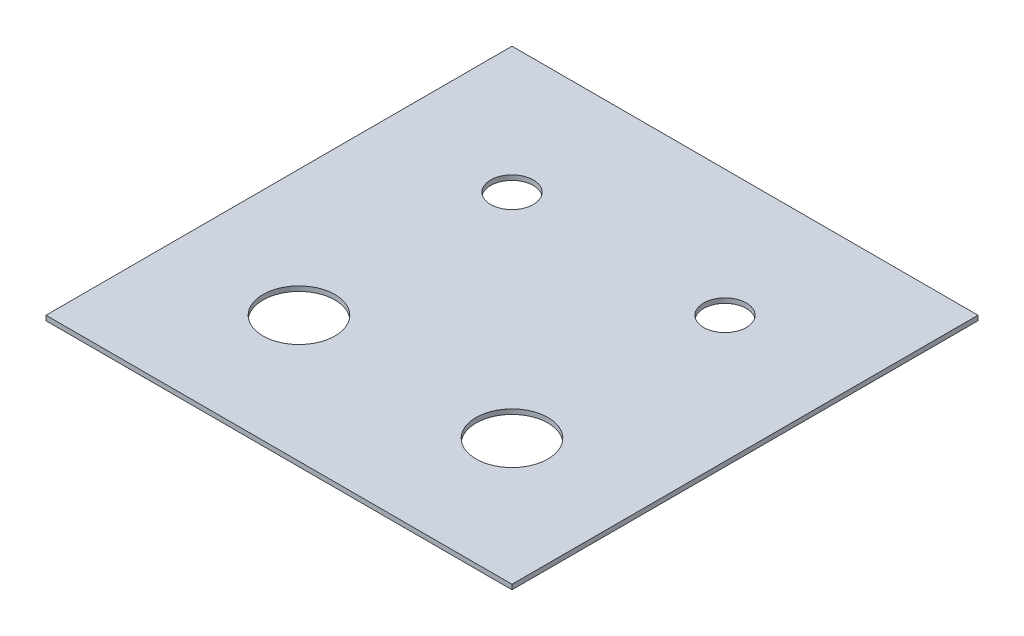
ISO-10303-21;
HEADER;
FILE_DESCRIPTION(('STEP AP214'),'2;1');
FILE_NAME('part.step','',(''),(''),'','','');
FILE_SCHEMA(('AUTOMOTIVE_DESIGN { 1 0 10303 214 1 1 1 1 }'));
ENDSEC;
DATA;
#1=APPLICATION_CONTEXT('core data for automotive mechanical design processes');
#2=APPLICATION_PROTOCOL_DEFINITION('international standard','automotive_design',2000,#1);
#3=PRODUCT_CONTEXT('',#1,'mechanical');
#4=PRODUCT('Part','Part','',(#3));
#5=PRODUCT_RELATED_PRODUCT_CATEGORY('part','',(#4));
#6=PRODUCT_DEFINITION_FORMATION('','',#4);
#7=PRODUCT_DEFINITION_CONTEXT('part definition',#1,'design');
#8=PRODUCT_DEFINITION('design','',#6,#7);
#9=PRODUCT_DEFINITION_SHAPE('','',#8);
#10=(LENGTH_UNIT() NAMED_UNIT(*) SI_UNIT(.MILLI.,.METRE.));
#11=(NAMED_UNIT(*) PLANE_ANGLE_UNIT() SI_UNIT($,.RADIAN.));
#12=(NAMED_UNIT(*) SI_UNIT($,.STERADIAN.) SOLID_ANGLE_UNIT());
#13=UNCERTAINTY_MEASURE_WITH_UNIT(LENGTH_MEASURE(1.E-05),#10,'distance_accuracy_value','');
#14=(GEOMETRIC_REPRESENTATION_CONTEXT(3) GLOBAL_UNCERTAINTY_ASSIGNED_CONTEXT((#13)) GLOBAL_UNIT_ASSIGNED_CONTEXT((#10,
#11,#12)) REPRESENTATION_CONTEXT('',''));
#15=CARTESIAN_POINT('',(0.,0.,0.));
#16=DIRECTION('',(0.,0.,1.));
#17=DIRECTION('',(1.,0.,0.));
#18=AXIS2_PLACEMENT_3D('',#15,#16,#17);
#19=CARTESIAN_POINT('',(0.,0.46,0.));
#20=DIRECTION('',(0.,1.,0.));
#21=DIRECTION('',(0.,0.,1.));
#22=AXIS2_PLACEMENT_3D('',#19,#20,#21);
#23=PLANE('',#22);
#24=CARTESIAN_POINT('',(-10.16,0.46,10.16));
#25=DIRECTION('',(0.,1.,0.));
#26=DIRECTION('',(0.,0.,1.));
#27=AXIS2_PLACEMENT_3D('',#24,#25,#26);
#28=CIRCLE('',#27,3.429);
#29=CARTESIAN_POINT('',(-10.16,0.46,13.589));
#30=VERTEX_POINT('',#29);
#31=EDGE_CURVE('E147',#30,#30,#28,.T.);
#32=ORIENTED_EDGE('',*,*,#31,.F.);
#33=EDGE_LOOP('',(#32));
#34=FACE_BOUND('',#33,.T.);
#35=CARTESIAN_POINT('',(-10.16,0.46,-10.16));
#36=DIRECTION('',(0.,1.,0.));
#37=DIRECTION('',(0.,0.,1.));
#38=AXIS2_PLACEMENT_3D('',#35,#36,#37);
#39=CIRCLE('',#38,2.032);
#40=CARTESIAN_POINT('',(-10.16,0.46,-8.128));
#41=VERTEX_POINT('',#40);
#42=EDGE_CURVE('E117',#41,#41,#39,.T.);
#43=ORIENTED_EDGE('',*,*,#42,.F.);
#44=EDGE_LOOP('',(#43));
#45=FACE_BOUND('',#44,.T.);
#46=DIRECTION('',(0.,0.,-1.));
#47=VECTOR('',#46,1.);
#48=CARTESIAN_POINT('',(22.225,0.46,-22.225));
#49=LINE('',#48,#47);
#50=CARTESIAN_POINT('',(22.225,0.46,22.225));
#51=VERTEX_POINT('',#50);
#52=CARTESIAN_POINT('',(22.225,0.46,-22.225));
#53=VERTEX_POINT('',#52);
#54=EDGE_CURVE('E97',#51,#53,#49,.T.);
#55=ORIENTED_EDGE('',*,*,#54,.T.);
#56=DIRECTION('',(-1.,0.,0.));
#57=VECTOR('',#56,1.);
#58=CARTESIAN_POINT('',(-22.225,0.46,-22.225));
#59=LINE('',#58,#57);
#60=CARTESIAN_POINT('',(-22.225,0.46,-22.225));
#61=VERTEX_POINT('',#60);
#62=EDGE_CURVE('E92',#53,#61,#59,.T.);
#63=ORIENTED_EDGE('',*,*,#62,.T.);
#64=DIRECTION('',(0.,0.,1.));
#65=VECTOR('',#64,1.);
#66=CARTESIAN_POINT('',(-22.225,0.46,-22.225));
#67=LINE('',#66,#65);
#68=CARTESIAN_POINT('',(-22.225,0.46,22.225));
#69=VERTEX_POINT('',#68);
#70=EDGE_CURVE('E95',#61,#69,#67,.T.);
#71=ORIENTED_EDGE('',*,*,#70,.T.);
#72=DIRECTION('',(1.,0.,0.));
#73=VECTOR('',#72,1.);
#74=CARTESIAN_POINT('',(-22.225,0.46,22.225));
#75=LINE('',#74,#73);
#76=EDGE_CURVE('E62',#69,#51,#75,.T.);
#77=ORIENTED_EDGE('',*,*,#76,.T.);
#78=EDGE_LOOP('',(#55,#63,#71,#77));
#79=FACE_BOUND('',#78,.T.);
#80=CARTESIAN_POINT('',(10.16,0.46,-10.16));
#81=DIRECTION('',(0.,1.,0.));
#82=DIRECTION('',(0.,0.,-1.));
#83=AXIS2_PLACEMENT_3D('',#80,#81,#82);
#84=CIRCLE('',#83,2.032);
#85=CARTESIAN_POINT('',(10.16,0.46,-12.192));
#86=VERTEX_POINT('',#85);
#87=EDGE_CURVE('E139',#86,#86,#84,.T.);
#88=ORIENTED_EDGE('',*,*,#87,.F.);
#89=EDGE_LOOP('',(#88));
#90=FACE_BOUND('',#89,.T.);
#91=CARTESIAN_POINT('',(10.16,0.46,10.16));
#92=DIRECTION('',(0.,1.,0.));
#93=DIRECTION('',(0.,0.,-1.));
#94=AXIS2_PLACEMENT_3D('',#91,#92,#93);
#95=CIRCLE('',#94,3.429);
#96=CARTESIAN_POINT('',(10.16,0.46,6.731));
#97=VERTEX_POINT('',#96);
#98=EDGE_CURVE('E155',#97,#97,#95,.T.);
#99=ORIENTED_EDGE('',*,*,#98,.F.);
#100=EDGE_LOOP('',(#99));
#101=FACE_BOUND('',#100,.T.);
#102=ADVANCED_FACE('F44',(#34,#45,#79,#90,#101),#23,.T.);
#103=CARTESIAN_POINT('',(0.,0.,0.));
#104=DIRECTION('',(0.,1.,0.));
#105=DIRECTION('',(0.,0.,1.));
#106=AXIS2_PLACEMENT_3D('',#103,#104,#105);
#107=PLANE('',#106);
#108=DIRECTION('',(0.,0.,-1.));
#109=VECTOR('',#108,1.);
#110=CARTESIAN_POINT('',(22.225,0.,-22.225));
#111=LINE('',#110,#109);
#112=CARTESIAN_POINT('',(22.225,0.,22.225));
#113=VERTEX_POINT('',#112);
#114=CARTESIAN_POINT('',(22.225,0.,-22.225));
#115=VERTEX_POINT('',#114);
#116=EDGE_CURVE('E113',#113,#115,#111,.T.);
#117=ORIENTED_EDGE('',*,*,#116,.F.);
#118=DIRECTION('',(1.,0.,0.));
#119=VECTOR('',#118,1.);
#120=CARTESIAN_POINT('',(-22.225,0.,22.225));
#121=LINE('',#120,#119);
#122=CARTESIAN_POINT('',(-22.225,0.,22.225));
#123=VERTEX_POINT('',#122);
#124=EDGE_CURVE('E85',#123,#113,#121,.T.);
#125=ORIENTED_EDGE('',*,*,#124,.F.);
#126=DIRECTION('',(0.,0.,1.));
#127=VECTOR('',#126,1.);
#128=CARTESIAN_POINT('',(-22.225,0.,-22.225));
#129=LINE('',#128,#127);
#130=CARTESIAN_POINT('',(-22.225,0.,-22.225));
#131=VERTEX_POINT('',#130);
#132=EDGE_CURVE('E79',#131,#123,#129,.T.);
#133=ORIENTED_EDGE('',*,*,#132,.F.);
#134=DIRECTION('',(-1.,0.,0.));
#135=VECTOR('',#134,1.);
#136=CARTESIAN_POINT('',(-22.225,0.,-22.225));
#137=LINE('',#136,#135);
#138=EDGE_CURVE('E102',#115,#131,#137,.T.);
#139=ORIENTED_EDGE('',*,*,#138,.F.);
#140=EDGE_LOOP('',(#117,#125,#133,#139));
#141=FACE_BOUND('',#140,.T.);
#142=CARTESIAN_POINT('',(-10.16,0.,-10.16));
#143=DIRECTION('',(0.,1.,0.));
#144=DIRECTION('',(0.,0.,1.));
#145=AXIS2_PLACEMENT_3D('',#142,#143,#144);
#146=CIRCLE('',#145,2.032);
#147=CARTESIAN_POINT('',(-10.16,0.,-8.128));
#148=VERTEX_POINT('',#147);
#149=EDGE_CURVE('E135',#148,#148,#146,.T.);
#150=ORIENTED_EDGE('',*,*,#149,.T.);
#151=EDGE_LOOP('',(#150));
#152=FACE_BOUND('',#151,.T.);
#153=CARTESIAN_POINT('',(10.16,0.,-10.16));
#154=DIRECTION('',(0.,1.,0.));
#155=DIRECTION('',(0.,0.,-1.));
#156=AXIS2_PLACEMENT_3D('',#153,#154,#155);
#157=CIRCLE('',#156,2.032);
#158=CARTESIAN_POINT('',(10.16,0.,-12.192));
#159=VERTEX_POINT('',#158);
#160=EDGE_CURVE('E143',#159,#159,#157,.T.);
#161=ORIENTED_EDGE('',*,*,#160,.T.);
#162=EDGE_LOOP('',(#161));
#163=FACE_BOUND('',#162,.T.);
#164=CARTESIAN_POINT('',(-10.16,0.,10.16));
#165=DIRECTION('',(0.,1.,0.));
#166=DIRECTION('',(0.,0.,1.));
#167=AXIS2_PLACEMENT_3D('',#164,#165,#166);
#168=CIRCLE('',#167,3.429);
#169=CARTESIAN_POINT('',(-10.16,0.,13.589));
#170=VERTEX_POINT('',#169);
#171=EDGE_CURVE('E151',#170,#170,#168,.T.);
#172=ORIENTED_EDGE('',*,*,#171,.T.);
#173=EDGE_LOOP('',(#172));
#174=FACE_BOUND('',#173,.T.);
#175=CARTESIAN_POINT('',(10.16,0.,10.16));
#176=DIRECTION('',(0.,1.,0.));
#177=DIRECTION('',(0.,0.,-1.));
#178=AXIS2_PLACEMENT_3D('',#175,#176,#177);
#179=CIRCLE('',#178,3.429);
#180=CARTESIAN_POINT('',(10.16,0.,6.731));
#181=VERTEX_POINT('',#180);
#182=EDGE_CURVE('E159',#181,#181,#179,.T.);
#183=ORIENTED_EDGE('',*,*,#182,.T.);
#184=EDGE_LOOP('',(#183));
#185=FACE_BOUND('',#184,.T.);
#186=ADVANCED_FACE('F130',(#141,#152,#163,#174,#185),#107,.F.);
#187=CARTESIAN_POINT('',(22.225,0.46,-22.225));
#188=DIRECTION('',(-1.,0.,0.));
#189=DIRECTION('',(0.,0.,1.));
#190=AXIS2_PLACEMENT_3D('',#187,#188,#189);
#191=PLANE('',#190);
#192=ORIENTED_EDGE('',*,*,#116,.T.);
#193=DIRECTION('',(0.,-1.,0.));
#194=VECTOR('',#193,1.);
#195=CARTESIAN_POINT('',(22.225,0.46,-22.225));
#196=LINE('',#195,#194);
#197=EDGE_CURVE('E11',#53,#115,#196,.T.);
#198=ORIENTED_EDGE('',*,*,#197,.F.);
#199=ORIENTED_EDGE('',*,*,#54,.F.);
#200=DIRECTION('',(0.,-1.,0.));
#201=VECTOR('',#200,1.);
#202=CARTESIAN_POINT('',(22.225,0.46,22.225));
#203=LINE('',#202,#201);
#204=EDGE_CURVE('E109',#51,#113,#203,.T.);
#205=ORIENTED_EDGE('',*,*,#204,.T.);
#206=EDGE_LOOP('',(#192,#198,#199,#205));
#207=FACE_BOUND('',#206,.T.);
#208=ADVANCED_FACE('F46',(#207),#191,.F.);
#209=CARTESIAN_POINT('',(-22.225,0.46,-22.225));
#210=DIRECTION('',(0.,0.,1.));
#211=DIRECTION('',(1.,0.,0.));
#212=AXIS2_PLACEMENT_3D('',#209,#210,#211);
#213=PLANE('',#212);
#214=ORIENTED_EDGE('',*,*,#138,.T.);
#215=DIRECTION('',(0.,-1.,0.));
#216=VECTOR('',#215,1.);
#217=CARTESIAN_POINT('',(-22.225,0.46,-22.225));
#218=LINE('',#217,#216);
#219=EDGE_CURVE('E54',#61,#131,#218,.T.);
#220=ORIENTED_EDGE('',*,*,#219,.F.);
#221=ORIENTED_EDGE('',*,*,#62,.F.);
#222=ORIENTED_EDGE('',*,*,#197,.T.);
#223=EDGE_LOOP('',(#214,#220,#221,#222));
#224=FACE_BOUND('',#223,.T.);
#225=ADVANCED_FACE('F101',(#224),#213,.F.);
#226=CARTESIAN_POINT('',(-22.225,0.46,-22.225));
#227=DIRECTION('',(1.,0.,0.));
#228=DIRECTION('',(0.,0.,-1.));
#229=AXIS2_PLACEMENT_3D('',#226,#227,#228);
#230=PLANE('',#229);
#231=ORIENTED_EDGE('',*,*,#132,.T.);
#232=DIRECTION('',(0.,-1.,0.));
#233=VECTOR('',#232,1.);
#234=CARTESIAN_POINT('',(-22.225,0.46,22.225));
#235=LINE('',#234,#233);
#236=EDGE_CURVE('E104',#69,#123,#235,.T.);
#237=ORIENTED_EDGE('',*,*,#236,.F.);
#238=ORIENTED_EDGE('',*,*,#70,.F.);
#239=ORIENTED_EDGE('',*,*,#219,.T.);
#240=EDGE_LOOP('',(#231,#237,#238,#239));
#241=FACE_BOUND('',#240,.T.);
#242=ADVANCED_FACE('F105',(#241),#230,.F.);
#243=CARTESIAN_POINT('',(-22.225,0.46,22.225));
#244=DIRECTION('',(0.,0.,-1.));
#245=DIRECTION('',(-1.,0.,0.));
#246=AXIS2_PLACEMENT_3D('',#243,#244,#245);
#247=PLANE('',#246);
#248=ORIENTED_EDGE('',*,*,#124,.T.);
#249=ORIENTED_EDGE('',*,*,#204,.F.);
#250=ORIENTED_EDGE('',*,*,#76,.F.);
#251=ORIENTED_EDGE('',*,*,#236,.T.);
#252=EDGE_LOOP('',(#248,#249,#250,#251));
#253=FACE_BOUND('',#252,.T.);
#254=ADVANCED_FACE('F127',(#253),#247,.F.);
#255=CARTESIAN_POINT('',(-10.16,0.46,-10.16));
#256=DIRECTION('',(0.,-1.,0.));
#257=DIRECTION('',(0.,0.,-1.));
#258=AXIS2_PLACEMENT_3D('',#255,#256,#257);
#259=CYLINDRICAL_SURFACE('',#258,2.032);
#260=ORIENTED_EDGE('',*,*,#42,.T.);
#261=EDGE_LOOP('',(#260));
#262=FACE_BOUND('',#261,.T.);
#263=ORIENTED_EDGE('',*,*,#149,.F.);
#264=EDGE_LOOP('',(#263));
#265=FACE_BOUND('',#264,.T.);
#266=ADVANCED_FACE('F180',(#262,#265),#259,.F.);
#267=CARTESIAN_POINT('',(10.16,0.46,-10.16));
#268=DIRECTION('',(0.,-1.,0.));
#269=DIRECTION('',(0.,0.,-1.));
#270=AXIS2_PLACEMENT_3D('',#267,#268,#269);
#271=CYLINDRICAL_SURFACE('',#270,2.032);
#272=ORIENTED_EDGE('',*,*,#87,.T.);
#273=EDGE_LOOP('',(#272));
#274=FACE_BOUND('',#273,.T.);
#275=ORIENTED_EDGE('',*,*,#160,.F.);
#276=EDGE_LOOP('',(#275));
#277=FACE_BOUND('',#276,.T.);
#278=ADVANCED_FACE('F225',(#274,#277),#271,.F.);
#279=CARTESIAN_POINT('',(-10.16,0.46,10.16));
#280=DIRECTION('',(0.,-1.,0.));
#281=DIRECTION('',(0.,0.,-1.));
#282=AXIS2_PLACEMENT_3D('',#279,#280,#281);
#283=CYLINDRICAL_SURFACE('',#282,3.429);
#284=ORIENTED_EDGE('',*,*,#31,.T.);
#285=EDGE_LOOP('',(#284));
#286=FACE_BOUND('',#285,.T.);
#287=ORIENTED_EDGE('',*,*,#171,.F.);
#288=EDGE_LOOP('',(#287));
#289=FACE_BOUND('',#288,.T.);
#290=ADVANCED_FACE('F233',(#286,#289),#283,.F.);
#291=CARTESIAN_POINT('',(10.16,0.46,10.16));
#292=DIRECTION('',(0.,-1.,0.));
#293=DIRECTION('',(0.,0.,-1.));
#294=AXIS2_PLACEMENT_3D('',#291,#292,#293);
#295=CYLINDRICAL_SURFACE('',#294,3.429);
#296=ORIENTED_EDGE('',*,*,#98,.T.);
#297=EDGE_LOOP('',(#296));
#298=FACE_BOUND('',#297,.T.);
#299=ORIENTED_EDGE('',*,*,#182,.F.);
#300=EDGE_LOOP('',(#299));
#301=FACE_BOUND('',#300,.T.);
#302=ADVANCED_FACE('F167',(#298,#301),#295,.F.);
#303=CLOSED_SHELL('',(#102,#186,#208,#225,#242,#254,#266,#278,#290,#302));
#304=MANIFOLD_SOLID_BREP('B2',#303);
#305=ADVANCED_BREP_SHAPE_REPRESENTATION('',(#18,#304),#14);
#306=SHAPE_DEFINITION_REPRESENTATION(#9,#305);
ENDSEC;
END-ISO-10303-21;
